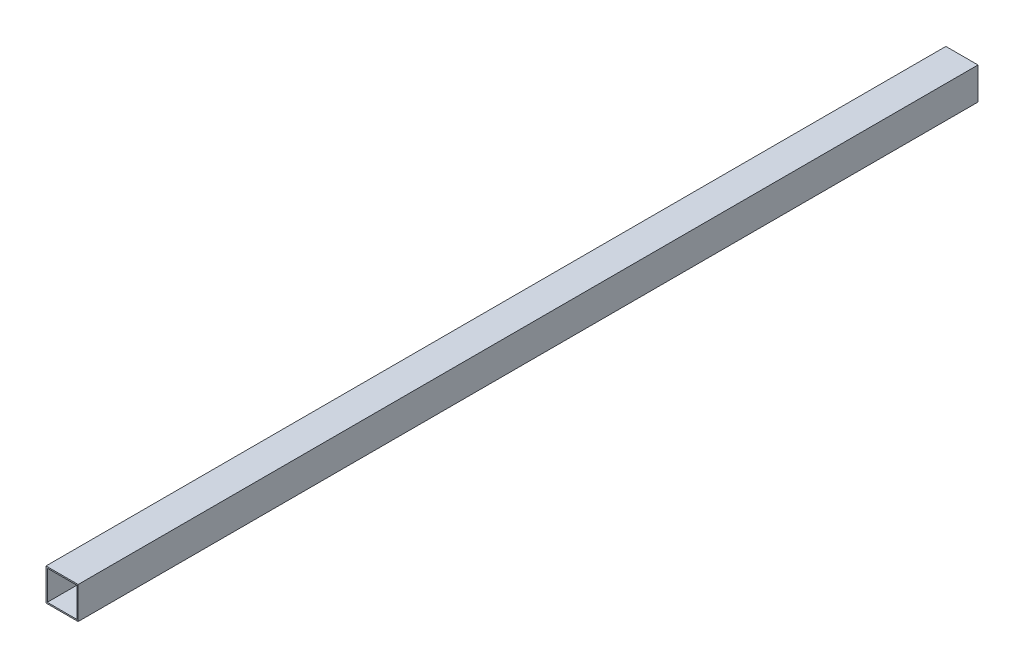
ISO-10303-21;
HEADER;
FILE_DESCRIPTION(('STEP AP214'),'2;1');
FILE_NAME('part.step','',(''),(''),'','','');
FILE_SCHEMA(('AUTOMOTIVE_DESIGN { 1 0 10303 214 1 1 1 1 }'));
ENDSEC;
DATA;
#1=APPLICATION_CONTEXT('core data for automotive mechanical design processes');
#2=APPLICATION_PROTOCOL_DEFINITION('international standard','automotive_design',2000,#1);
#3=PRODUCT_CONTEXT('',#1,'mechanical');
#4=PRODUCT('Part','Part','',(#3));
#5=PRODUCT_RELATED_PRODUCT_CATEGORY('part','',(#4));
#6=PRODUCT_DEFINITION_FORMATION('','',#4);
#7=PRODUCT_DEFINITION_CONTEXT('part definition',#1,'design');
#8=PRODUCT_DEFINITION('design','',#6,#7);
#9=PRODUCT_DEFINITION_SHAPE('','',#8);
#10=(LENGTH_UNIT() NAMED_UNIT(*) SI_UNIT(.MILLI.,.METRE.));
#11=(NAMED_UNIT(*) PLANE_ANGLE_UNIT() SI_UNIT($,.RADIAN.));
#12=(NAMED_UNIT(*) SI_UNIT($,.STERADIAN.) SOLID_ANGLE_UNIT());
#13=UNCERTAINTY_MEASURE_WITH_UNIT(LENGTH_MEASURE(1.E-05),#10,'distance_accuracy_value','');
#14=(GEOMETRIC_REPRESENTATION_CONTEXT(3) GLOBAL_UNCERTAINTY_ASSIGNED_CONTEXT((#13)) GLOBAL_UNIT_ASSIGNED_CONTEXT((#10,
#11,#12)) REPRESENTATION_CONTEXT('',''));
#15=CARTESIAN_POINT('',(0.,0.,0.));
#16=DIRECTION('',(0.,0.,1.));
#17=DIRECTION('',(1.,0.,0.));
#18=AXIS2_PLACEMENT_3D('',#15,#16,#17);
#19=CARTESIAN_POINT('',(0.,0.,840.));
#20=DIRECTION('',(0.,0.,-1.));
#21=DIRECTION('',(-1.,0.,0.));
#22=AXIS2_PLACEMENT_3D('',#19,#20,#21);
#23=PLANE('',#22);
#24=DIRECTION('',(0.,1.,0.));
#25=VECTOR('',#24,1.);
#26=CARTESIAN_POINT('',(15.,-15.,840.));
#27=LINE('',#26,#25);
#28=CARTESIAN_POINT('',(15.,-15.,840.));
#29=VERTEX_POINT('',#28);
#30=CARTESIAN_POINT('',(15.,15.,840.));
#31=VERTEX_POINT('',#30);
#32=EDGE_CURVE('E135',#29,#31,#27,.T.);
#33=ORIENTED_EDGE('',*,*,#32,.T.);
#34=DIRECTION('',(-1.,0.,0.));
#35=VECTOR('',#34,1.);
#36=CARTESIAN_POINT('',(-15.,15.,840.));
#37=LINE('',#36,#35);
#38=CARTESIAN_POINT('',(-15.,15.,840.));
#39=VERTEX_POINT('',#38);
#40=EDGE_CURVE('E138',#31,#39,#37,.T.);
#41=ORIENTED_EDGE('',*,*,#40,.T.);
#42=DIRECTION('',(0.,-1.,0.));
#43=VECTOR('',#42,1.);
#44=CARTESIAN_POINT('',(-15.,-15.,840.));
#45=LINE('',#44,#43);
#46=CARTESIAN_POINT('',(-15.,-15.,840.));
#47=VERTEX_POINT('',#46);
#48=EDGE_CURVE('E141',#39,#47,#45,.T.);
#49=ORIENTED_EDGE('',*,*,#48,.T.);
#50=DIRECTION('',(1.,0.,0.));
#51=VECTOR('',#50,1.);
#52=CARTESIAN_POINT('',(-15.,-15.,840.));
#53=LINE('',#52,#51);
#54=EDGE_CURVE('E143',#47,#29,#53,.T.);
#55=ORIENTED_EDGE('',*,*,#54,.T.);
#56=EDGE_LOOP('',(#33,#41,#49,#55));
#57=FACE_BOUND('',#56,.T.);
#58=DIRECTION('',(0.,-1.,0.));
#59=VECTOR('',#58,1.);
#60=CARTESIAN_POINT('',(-13.8,-13.8,840.));
#61=LINE('',#60,#59);
#62=CARTESIAN_POINT('',(-13.8,13.8,840.));
#63=VERTEX_POINT('',#62);
#64=CARTESIAN_POINT('',(-13.8,-13.8,840.));
#65=VERTEX_POINT('',#64);
#66=EDGE_CURVE('E99',#63,#65,#61,.T.);
#67=ORIENTED_EDGE('',*,*,#66,.F.);
#68=DIRECTION('',(-1.,0.,0.));
#69=VECTOR('',#68,1.);
#70=CARTESIAN_POINT('',(-13.8,13.8,840.));
#71=LINE('',#70,#69);
#72=CARTESIAN_POINT('',(13.8,13.8,840.));
#73=VERTEX_POINT('',#72);
#74=EDGE_CURVE('E121',#73,#63,#71,.T.);
#75=ORIENTED_EDGE('',*,*,#74,.F.);
#76=DIRECTION('',(0.,1.,0.));
#77=VECTOR('',#76,1.);
#78=CARTESIAN_POINT('',(13.8,-13.8,840.));
#79=LINE('',#78,#77);
#80=CARTESIAN_POINT('',(13.8,-13.8,840.));
#81=VERTEX_POINT('',#80);
#82=EDGE_CURVE('E119',#81,#73,#79,.T.);
#83=ORIENTED_EDGE('',*,*,#82,.F.);
#84=DIRECTION('',(1.,0.,0.));
#85=VECTOR('',#84,1.);
#86=CARTESIAN_POINT('',(-13.8,-13.8,840.));
#87=LINE('',#86,#85);
#88=EDGE_CURVE('E107',#65,#81,#87,.T.);
#89=ORIENTED_EDGE('',*,*,#88,.F.);
#90=EDGE_LOOP('',(#67,#75,#83,#89));
#91=FACE_BOUND('',#90,.T.);
#92=ADVANCED_FACE('F34',(#57,#91),#23,.F.);
#93=CARTESIAN_POINT('',(0.,0.,0.));
#94=DIRECTION('',(0.,0.,-1.));
#95=DIRECTION('',(-1.,0.,0.));
#96=AXIS2_PLACEMENT_3D('',#93,#94,#95);
#97=PLANE('',#96);
#98=DIRECTION('',(0.,1.,0.));
#99=VECTOR('',#98,1.);
#100=CARTESIAN_POINT('',(15.,-15.,0.));
#101=LINE('',#100,#99);
#102=CARTESIAN_POINT('',(15.,-15.,0.));
#103=VERTEX_POINT('',#102);
#104=CARTESIAN_POINT('',(15.,15.,0.));
#105=VERTEX_POINT('',#104);
#106=EDGE_CURVE('E115',#103,#105,#101,.T.);
#107=ORIENTED_EDGE('',*,*,#106,.F.);
#108=DIRECTION('',(1.,0.,0.));
#109=VECTOR('',#108,1.);
#110=CARTESIAN_POINT('',(-15.,-15.,0.));
#111=LINE('',#110,#109);
#112=CARTESIAN_POINT('',(-15.,-15.,0.));
#113=VERTEX_POINT('',#112);
#114=EDGE_CURVE('E139',#113,#103,#111,.T.);
#115=ORIENTED_EDGE('',*,*,#114,.F.);
#116=DIRECTION('',(0.,-1.,0.));
#117=VECTOR('',#116,1.);
#118=CARTESIAN_POINT('',(-15.,-15.,0.));
#119=LINE('',#118,#117);
#120=CARTESIAN_POINT('',(-15.,15.,0.));
#121=VERTEX_POINT('',#120);
#122=EDGE_CURVE('E150',#121,#113,#119,.T.);
#123=ORIENTED_EDGE('',*,*,#122,.F.);
#124=DIRECTION('',(-1.,0.,0.));
#125=VECTOR('',#124,1.);
#126=CARTESIAN_POINT('',(-15.,15.,0.));
#127=LINE('',#126,#125);
#128=EDGE_CURVE('E148',#105,#121,#127,.T.);
#129=ORIENTED_EDGE('',*,*,#128,.F.);
#130=EDGE_LOOP('',(#107,#115,#123,#129));
#131=FACE_BOUND('',#130,.T.);
#132=DIRECTION('',(-1.,0.,0.));
#133=VECTOR('',#132,1.);
#134=CARTESIAN_POINT('',(-13.8,13.8,0.));
#135=LINE('',#134,#133);
#136=CARTESIAN_POINT('',(13.8,13.8,0.));
#137=VERTEX_POINT('',#136);
#138=CARTESIAN_POINT('',(-13.8,13.8,0.));
#139=VERTEX_POINT('',#138);
#140=EDGE_CURVE('E108',#137,#139,#135,.T.);
#141=ORIENTED_EDGE('',*,*,#140,.T.);
#142=DIRECTION('',(0.,-1.,0.));
#143=VECTOR('',#142,1.);
#144=CARTESIAN_POINT('',(-13.8,-13.8,0.));
#145=LINE('',#144,#143);
#146=CARTESIAN_POINT('',(-13.8,-13.8,0.));
#147=VERTEX_POINT('',#146);
#148=EDGE_CURVE('E57',#139,#147,#145,.T.);
#149=ORIENTED_EDGE('',*,*,#148,.T.);
#150=DIRECTION('',(1.,0.,0.));
#151=VECTOR('',#150,1.);
#152=CARTESIAN_POINT('',(-13.8,-13.8,0.));
#153=LINE('',#152,#151);
#154=CARTESIAN_POINT('',(13.8,-13.8,0.));
#155=VERTEX_POINT('',#154);
#156=EDGE_CURVE('E114',#147,#155,#153,.T.);
#157=ORIENTED_EDGE('',*,*,#156,.T.);
#158=DIRECTION('',(0.,1.,0.));
#159=VECTOR('',#158,1.);
#160=CARTESIAN_POINT('',(13.8,-13.8,0.));
#161=LINE('',#160,#159);
#162=EDGE_CURVE('E127',#155,#137,#161,.T.);
#163=ORIENTED_EDGE('',*,*,#162,.T.);
#164=EDGE_LOOP('',(#141,#149,#157,#163));
#165=FACE_BOUND('',#164,.T.);
#166=ADVANCED_FACE('F168',(#131,#165),#97,.T.);
#167=CARTESIAN_POINT('',(15.,-15.,840.));
#168=DIRECTION('',(-1.,0.,0.));
#169=DIRECTION('',(0.,0.,1.));
#170=AXIS2_PLACEMENT_3D('',#167,#168,#169);
#171=PLANE('',#170);
#172=ORIENTED_EDGE('',*,*,#106,.T.);
#173=DIRECTION('',(0.,0.,-1.));
#174=VECTOR('',#173,1.);
#175=CARTESIAN_POINT('',(15.,15.,840.));
#176=LINE('',#175,#174);
#177=EDGE_CURVE('E11',#31,#105,#176,.T.);
#178=ORIENTED_EDGE('',*,*,#177,.F.);
#179=ORIENTED_EDGE('',*,*,#32,.F.);
#180=DIRECTION('',(0.,0.,-1.));
#181=VECTOR('',#180,1.);
#182=CARTESIAN_POINT('',(15.,-15.,840.));
#183=LINE('',#182,#181);
#184=EDGE_CURVE('E145',#29,#103,#183,.T.);
#185=ORIENTED_EDGE('',*,*,#184,.T.);
#186=EDGE_LOOP('',(#172,#178,#179,#185));
#187=FACE_BOUND('',#186,.T.);
#188=ADVANCED_FACE('F36',(#187),#171,.F.);
#189=CARTESIAN_POINT('',(-15.,15.,840.));
#190=DIRECTION('',(0.,-1.,0.));
#191=DIRECTION('',(0.,0.,-1.));
#192=AXIS2_PLACEMENT_3D('',#189,#190,#191);
#193=PLANE('',#192);
#194=ORIENTED_EDGE('',*,*,#128,.T.);
#195=DIRECTION('',(0.,0.,-1.));
#196=VECTOR('',#195,1.);
#197=CARTESIAN_POINT('',(-15.,15.,840.));
#198=LINE('',#197,#196);
#199=EDGE_CURVE('E42',#39,#121,#198,.T.);
#200=ORIENTED_EDGE('',*,*,#199,.F.);
#201=ORIENTED_EDGE('',*,*,#40,.F.);
#202=ORIENTED_EDGE('',*,*,#177,.T.);
#203=EDGE_LOOP('',(#194,#200,#201,#202));
#204=FACE_BOUND('',#203,.T.);
#205=ADVANCED_FACE('F178',(#204),#193,.F.);
#206=CARTESIAN_POINT('',(-15.,-15.,840.));
#207=DIRECTION('',(1.,0.,0.));
#208=DIRECTION('',(0.,0.,-1.));
#209=AXIS2_PLACEMENT_3D('',#206,#207,#208);
#210=PLANE('',#209);
#211=ORIENTED_EDGE('',*,*,#122,.T.);
#212=DIRECTION('',(0.,0.,-1.));
#213=VECTOR('',#212,1.);
#214=CARTESIAN_POINT('',(-15.,-15.,840.));
#215=LINE('',#214,#213);
#216=EDGE_CURVE('E155',#47,#113,#215,.T.);
#217=ORIENTED_EDGE('',*,*,#216,.F.);
#218=ORIENTED_EDGE('',*,*,#48,.F.);
#219=ORIENTED_EDGE('',*,*,#199,.T.);
#220=EDGE_LOOP('',(#211,#217,#218,#219));
#221=FACE_BOUND('',#220,.T.);
#222=ADVANCED_FACE('F162',(#221),#210,.F.);
#223=CARTESIAN_POINT('',(-15.,-15.,840.));
#224=DIRECTION('',(0.,1.,0.));
#225=DIRECTION('',(0.,0.,1.));
#226=AXIS2_PLACEMENT_3D('',#223,#224,#225);
#227=PLANE('',#226);
#228=ORIENTED_EDGE('',*,*,#114,.T.);
#229=ORIENTED_EDGE('',*,*,#184,.F.);
#230=ORIENTED_EDGE('',*,*,#54,.F.);
#231=ORIENTED_EDGE('',*,*,#216,.T.);
#232=EDGE_LOOP('',(#228,#229,#230,#231));
#233=FACE_BOUND('',#232,.T.);
#234=ADVANCED_FACE('F172',(#233),#227,.F.);
#235=CARTESIAN_POINT('',(-13.8,-13.8,840.));
#236=DIRECTION('',(1.,0.,0.));
#237=DIRECTION('',(0.,0.,-1.));
#238=AXIS2_PLACEMENT_3D('',#235,#236,#237);
#239=PLANE('',#238);
#240=ORIENTED_EDGE('',*,*,#148,.F.);
#241=DIRECTION('',(0.,0.,-1.));
#242=VECTOR('',#241,1.);
#243=CARTESIAN_POINT('',(-13.8,13.8,840.));
#244=LINE('',#243,#242);
#245=EDGE_CURVE('E103',#63,#139,#244,.T.);
#246=ORIENTED_EDGE('',*,*,#245,.F.);
#247=ORIENTED_EDGE('',*,*,#66,.T.);
#248=DIRECTION('',(0.,0.,-1.));
#249=VECTOR('',#248,1.);
#250=CARTESIAN_POINT('',(-13.8,-13.8,840.));
#251=LINE('',#250,#249);
#252=EDGE_CURVE('E102',#65,#147,#251,.T.);
#253=ORIENTED_EDGE('',*,*,#252,.T.);
#254=EDGE_LOOP('',(#240,#246,#247,#253));
#255=FACE_BOUND('',#254,.T.);
#256=ADVANCED_FACE('F101',(#255),#239,.T.);
#257=CARTESIAN_POINT('',(-13.8,-13.8,840.));
#258=DIRECTION('',(0.,1.,0.));
#259=DIRECTION('',(0.,0.,1.));
#260=AXIS2_PLACEMENT_3D('',#257,#258,#259);
#261=PLANE('',#260);
#262=ORIENTED_EDGE('',*,*,#156,.F.);
#263=ORIENTED_EDGE('',*,*,#252,.F.);
#264=ORIENTED_EDGE('',*,*,#88,.T.);
#265=DIRECTION('',(0.,0.,-1.));
#266=VECTOR('',#265,1.);
#267=CARTESIAN_POINT('',(13.8,-13.8,840.));
#268=LINE('',#267,#266);
#269=EDGE_CURVE('E116',#81,#155,#268,.T.);
#270=ORIENTED_EDGE('',*,*,#269,.T.);
#271=EDGE_LOOP('',(#262,#263,#264,#270));
#272=FACE_BOUND('',#271,.T.);
#273=ADVANCED_FACE('F111',(#272),#261,.T.);
#274=CARTESIAN_POINT('',(13.8,-13.8,840.));
#275=DIRECTION('',(-1.,0.,0.));
#276=DIRECTION('',(0.,-1.,0.));
#277=AXIS2_PLACEMENT_3D('',#274,#275,#276);
#278=PLANE('',#277);
#279=ORIENTED_EDGE('',*,*,#162,.F.);
#280=ORIENTED_EDGE('',*,*,#269,.F.);
#281=ORIENTED_EDGE('',*,*,#82,.T.);
#282=DIRECTION('',(0.,0.,-1.));
#283=VECTOR('',#282,1.);
#284=CARTESIAN_POINT('',(13.8,13.8,840.));
#285=LINE('',#284,#283);
#286=EDGE_CURVE('E49',#73,#137,#285,.T.);
#287=ORIENTED_EDGE('',*,*,#286,.T.);
#288=EDGE_LOOP('',(#279,#280,#281,#287));
#289=FACE_BOUND('',#288,.T.);
#290=ADVANCED_FACE('F201',(#289),#278,.T.);
#291=CARTESIAN_POINT('',(-13.8,13.8,840.));
#292=DIRECTION('',(0.,-1.,0.));
#293=DIRECTION('',(0.,0.,-1.));
#294=AXIS2_PLACEMENT_3D('',#291,#292,#293);
#295=PLANE('',#294);
#296=ORIENTED_EDGE('',*,*,#140,.F.);
#297=ORIENTED_EDGE('',*,*,#286,.F.);
#298=ORIENTED_EDGE('',*,*,#74,.T.);
#299=ORIENTED_EDGE('',*,*,#245,.T.);
#300=EDGE_LOOP('',(#296,#297,#298,#299));
#301=FACE_BOUND('',#300,.T.);
#302=ADVANCED_FACE('F205',(#301),#295,.T.);
#303=CLOSED_SHELL('',(#92,#166,#188,#205,#222,#234,#256,#273,#290,#302));
#304=MANIFOLD_SOLID_BREP('B2',#303);
#305=ADVANCED_BREP_SHAPE_REPRESENTATION('',(#18,#304),#14);
#306=SHAPE_DEFINITION_REPRESENTATION(#9,#305);
ENDSEC;
END-ISO-10303-21;
